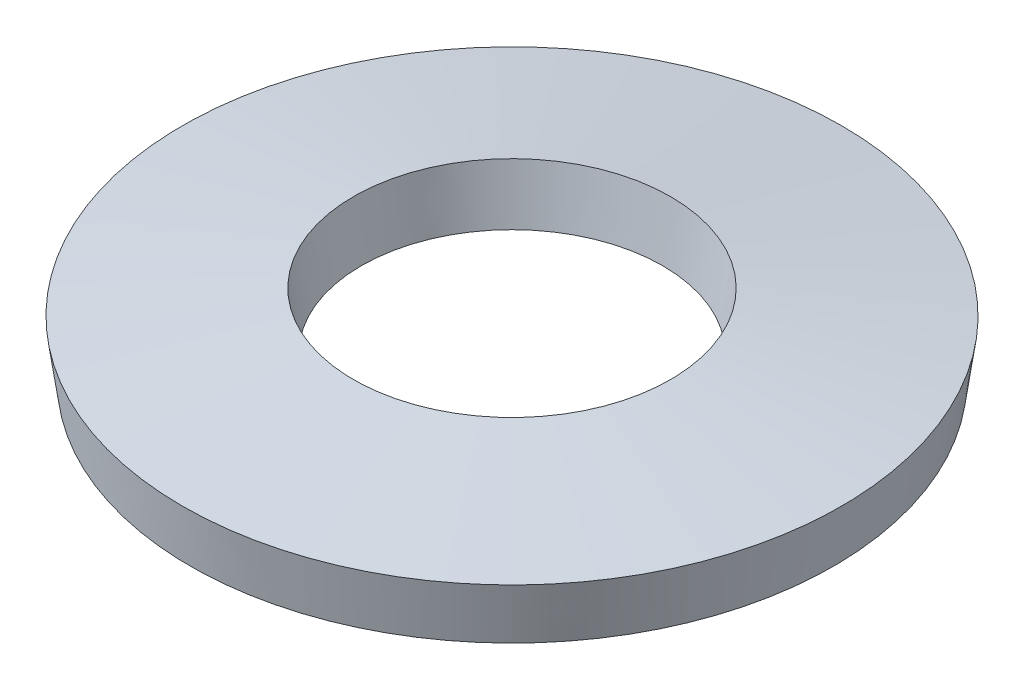
ISO-10303-21;
HEADER;
FILE_DESCRIPTION(('STEP AP214'),'2;1');
FILE_NAME('part.step','',(''),(''),'','','');
FILE_SCHEMA(('AUTOMOTIVE_DESIGN { 1 0 10303 214 1 1 1 1 }'));
ENDSEC;
DATA;
#1=APPLICATION_CONTEXT('core data for automotive mechanical design processes');
#2=APPLICATION_PROTOCOL_DEFINITION('international standard','automotive_design',2000,#1);
#3=PRODUCT_CONTEXT('',#1,'mechanical');
#4=PRODUCT('Part','Part','',(#3));
#5=PRODUCT_RELATED_PRODUCT_CATEGORY('part','',(#4));
#6=PRODUCT_DEFINITION_FORMATION('','',#4);
#7=PRODUCT_DEFINITION_CONTEXT('part definition',#1,'design');
#8=PRODUCT_DEFINITION('design','',#6,#7);
#9=PRODUCT_DEFINITION_SHAPE('','',#8);
#10=(LENGTH_UNIT() NAMED_UNIT(*) SI_UNIT(.MILLI.,.METRE.));
#11=(NAMED_UNIT(*) PLANE_ANGLE_UNIT() SI_UNIT($,.RADIAN.));
#12=(NAMED_UNIT(*) SI_UNIT($,.STERADIAN.) SOLID_ANGLE_UNIT());
#13=UNCERTAINTY_MEASURE_WITH_UNIT(LENGTH_MEASURE(1.E-05),#10,'distance_accuracy_value','');
#14=(GEOMETRIC_REPRESENTATION_CONTEXT(3) GLOBAL_UNCERTAINTY_ASSIGNED_CONTEXT((#13)) GLOBAL_UNIT_ASSIGNED_CONTEXT((#10,
#11,#12)) REPRESENTATION_CONTEXT('',''));
#15=CARTESIAN_POINT('',(0.,0.,0.));
#16=DIRECTION('',(0.,0.,1.));
#17=DIRECTION('',(1.,0.,0.));
#18=AXIS2_PLACEMENT_3D('',#15,#16,#17);
#19=CARTESIAN_POINT('',(0.,0.,0.));
#20=DIRECTION('',(0.,1.,0.));
#21=DIRECTION('',(0.,0.,1.));
#22=AXIS2_PLACEMENT_3D('',#19,#20,#21);
#23=CONICAL_SURFACE('',#22,3.41630318333682,0.139951101538467);
#24=CARTESIAN_POINT('',(0.,0.594133691083455,0.));
#25=DIRECTION('',(0.,-1.,0.));
#26=DIRECTION('',(0.,0.,-1.));
#27=AXIS2_PLACEMENT_3D('',#24,#25,#26);
#28=CIRCLE('',#27,3.5);
#29=CARTESIAN_POINT('',(0.,0.594133691083455,-3.5));
#30=VERTEX_POINT('',#29);
#31=EDGE_CURVE('E10',#30,#30,#28,.T.);
#32=ORIENTED_EDGE('',*,*,#31,.T.);
#33=EDGE_LOOP('',(#32));
#34=FACE_BOUND('',#33,.T.);
#35=CARTESIAN_POINT('',(0.,0.,0.));
#36=DIRECTION('',(0.,-1.,0.));
#37=DIRECTION('',(0.,0.,-1.));
#38=AXIS2_PLACEMENT_3D('',#35,#36,#37);
#39=CIRCLE('',#38,3.41630318333682);
#40=CARTESIAN_POINT('',(0.,0.,-3.41630318333682));
#41=VERTEX_POINT('',#40);
#42=EDGE_CURVE('E52',#41,#41,#39,.T.);
#43=ORIENTED_EDGE('',*,*,#42,.F.);
#44=EDGE_LOOP('',(#43));
#45=FACE_BOUND('',#44,.T.);
#46=ADVANCED_FACE('F38',(#34,#45),#23,.T.);
#47=CARTESIAN_POINT('',(0.,0.594133691083455,0.));
#48=DIRECTION('',(0.,-1.,0.));
#49=DIRECTION('',(0.,0.,-1.));
#50=AXIS2_PLACEMENT_3D('',#47,#48,#49);
#51=CONICAL_SURFACE('',#50,3.5,1.43084522525643);
#52=CARTESIAN_POINT('',(0.,0.85,0.));
#53=DIRECTION('',(0.,-1.,0.));
#54=DIRECTION('',(0.,0.,-1.));
#55=AXIS2_PLACEMENT_3D('',#52,#53,#54);
#56=CIRCLE('',#55,1.68369681666318);
#57=CARTESIAN_POINT('',(0.,0.85,-1.68369681666318));
#58=VERTEX_POINT('',#57);
#59=EDGE_CURVE('E44',#58,#58,#56,.T.);
#60=ORIENTED_EDGE('',*,*,#59,.T.);
#61=EDGE_LOOP('',(#60));
#62=FACE_BOUND('',#61,.T.);
#63=ORIENTED_EDGE('',*,*,#31,.F.);
#64=EDGE_LOOP('',(#63));
#65=FACE_BOUND('',#64,.T.);
#66=ADVANCED_FACE('F62',(#62,#65),#51,.T.);
#67=CARTESIAN_POINT('',(0.,0.85,0.));
#68=DIRECTION('',(0.,1.,0.));
#69=DIRECTION('',(0.,0.,1.));
#70=AXIS2_PLACEMENT_3D('',#67,#68,#69);
#71=CONICAL_SURFACE('',#70,1.68369681666318,0.139951101538467);
#72=CARTESIAN_POINT('',(0.,0.255866308916546,0.));
#73=DIRECTION('',(0.,-1.,0.));
#74=DIRECTION('',(0.,0.,-1.));
#75=AXIS2_PLACEMENT_3D('',#72,#73,#74);
#76=CIRCLE('',#75,1.6);
#77=CARTESIAN_POINT('',(0.,0.255866308916546,-1.6));
#78=VERTEX_POINT('',#77);
#79=EDGE_CURVE('E48',#78,#78,#76,.T.);
#80=ORIENTED_EDGE('',*,*,#79,.T.);
#81=EDGE_LOOP('',(#80));
#82=FACE_BOUND('',#81,.T.);
#83=ORIENTED_EDGE('',*,*,#59,.F.);
#84=EDGE_LOOP('',(#83));
#85=FACE_BOUND('',#84,.T.);
#86=ADVANCED_FACE('F66',(#82,#85),#71,.F.);
#87=CARTESIAN_POINT('',(0.,0.255866308916546,0.));
#88=DIRECTION('',(0.,-1.,0.));
#89=DIRECTION('',(0.,0.,-1.));
#90=AXIS2_PLACEMENT_3D('',#87,#88,#89);
#91=CONICAL_SURFACE('',#90,1.6,1.43084522525643);
#92=ORIENTED_EDGE('',*,*,#42,.T.);
#93=EDGE_LOOP('',(#92));
#94=FACE_BOUND('',#93,.T.);
#95=ORIENTED_EDGE('',*,*,#79,.F.);
#96=EDGE_LOOP('',(#95));
#97=FACE_BOUND('',#96,.T.);
#98=ADVANCED_FACE('F58',(#94,#97),#91,.F.);
#99=CLOSED_SHELL('',(#46,#66,#86,#98));
#100=MANIFOLD_SOLID_BREP('B2',#99);
#101=ADVANCED_BREP_SHAPE_REPRESENTATION('',(#18,#100),#14);
#102=SHAPE_DEFINITION_REPRESENTATION(#9,#101);
ENDSEC;
END-ISO-10303-21;
